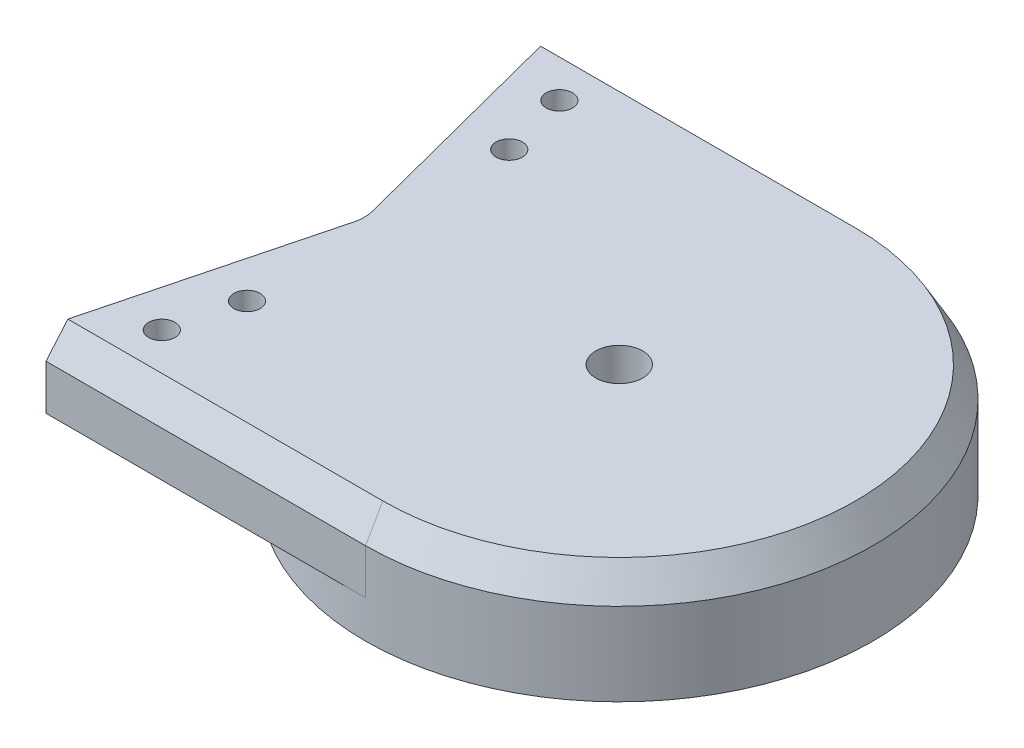
ISO-10303-21;
HEADER;
FILE_DESCRIPTION(('STEP AP214'),'2;1');
FILE_NAME('part.step','',(''),(''),'','','');
FILE_SCHEMA(('AUTOMOTIVE_DESIGN { 1 0 10303 214 1 1 1 1 }'));
ENDSEC;
DATA;
#1=APPLICATION_CONTEXT('core data for automotive mechanical design processes');
#2=APPLICATION_PROTOCOL_DEFINITION('international standard','automotive_design',2000,#1);
#3=PRODUCT_CONTEXT('',#1,'mechanical');
#4=PRODUCT('Part','Part','',(#3));
#5=PRODUCT_RELATED_PRODUCT_CATEGORY('part','',(#4));
#6=PRODUCT_DEFINITION_FORMATION('','',#4);
#7=PRODUCT_DEFINITION_CONTEXT('part definition',#1,'design');
#8=PRODUCT_DEFINITION('design','',#6,#7);
#9=PRODUCT_DEFINITION_SHAPE('','',#8);
#10=(LENGTH_UNIT() NAMED_UNIT(*) SI_UNIT(.MILLI.,.METRE.));
#11=(NAMED_UNIT(*) PLANE_ANGLE_UNIT() SI_UNIT($,.RADIAN.));
#12=(NAMED_UNIT(*) SI_UNIT($,.STERADIAN.) SOLID_ANGLE_UNIT());
#13=UNCERTAINTY_MEASURE_WITH_UNIT(LENGTH_MEASURE(1.E-05),#10,'distance_accuracy_value','');
#14=(GEOMETRIC_REPRESENTATION_CONTEXT(3) GLOBAL_UNCERTAINTY_ASSIGNED_CONTEXT((#13)) GLOBAL_UNIT_ASSIGNED_CONTEXT((#10,
#11,#12)) REPRESENTATION_CONTEXT('',''));
#15=CARTESIAN_POINT('',(0.,0.,0.));
#16=DIRECTION('',(0.,0.,1.));
#17=DIRECTION('',(1.,0.,0.));
#18=AXIS2_PLACEMENT_3D('',#15,#16,#17);
#19=CARTESIAN_POINT('',(123.,64.,32.4999999999989));
#20=DIRECTION('',(0.,-1.,0.));
#21=DIRECTION('',(0.,0.,-1.));
#22=AXIS2_PLACEMENT_3D('',#19,#20,#21);
#23=PLANE('',#22);
#24=CARTESIAN_POINT('',(123.,64.,32.4999999999989));
#25=DIRECTION('',(0.,-1.,0.));
#26=DIRECTION('',(0.,0.,-1.));
#27=AXIS2_PLACEMENT_3D('',#24,#25,#26);
#28=CIRCLE('',#27,16.85);
#29=CARTESIAN_POINT('',(123.,64.,15.6499999999989));
#30=VERTEX_POINT('',#29);
#31=EDGE_CURVE('E177',#30,#30,#28,.T.);
#32=ORIENTED_EDGE('',*,*,#31,.F.);
#33=EDGE_LOOP('',(#32));
#34=FACE_BOUND('',#33,.T.);
#35=CARTESIAN_POINT('',(123.,64.,32.4999999999989));
#36=DIRECTION('',(0.,-1.,0.));
#37=DIRECTION('',(0.,0.,-1.));
#38=AXIS2_PLACEMENT_3D('',#35,#36,#37);
#39=CIRCLE('',#38,25.);
#40=CARTESIAN_POINT('',(123.,64.,7.49999999999892));
#41=VERTEX_POINT('',#40);
#42=EDGE_CURVE('E691',#41,#41,#39,.T.);
#43=ORIENTED_EDGE('',*,*,#42,.T.);
#44=EDGE_LOOP('',(#43));
#45=FACE_BOUND('',#44,.T.);
#46=ADVANCED_FACE('F43',(#34,#45),#23,.T.);
#47=CARTESIAN_POINT('',(123.,60.65,32.4999999999989));
#48=DIRECTION('',(0.,-1.,0.));
#49=DIRECTION('',(0.,0.,-1.));
#50=AXIS2_PLACEMENT_3D('',#47,#48,#49);
#51=PLANE('',#50);
#52=CARTESIAN_POINT('',(123.,60.65,32.4999999999989));
#53=DIRECTION('',(0.,-1.,0.));
#54=DIRECTION('',(0.,0.,-1.));
#55=AXIS2_PLACEMENT_3D('',#52,#53,#54);
#56=CIRCLE('',#55,16.85);
#57=CARTESIAN_POINT('',(123.,60.65,15.6499999999989));
#58=VERTEX_POINT('',#57);
#59=EDGE_CURVE('E181',#58,#58,#56,.T.);
#60=ORIENTED_EDGE('',*,*,#59,.T.);
#61=EDGE_LOOP('',(#60));
#62=FACE_BOUND('',#61,.T.);
#63=CARTESIAN_POINT('',(123.,60.65,32.4999999999989));
#64=DIRECTION('',(0.,-1.,0.));
#65=DIRECTION('',(0.,0.,-1.));
#66=AXIS2_PLACEMENT_3D('',#63,#64,#65);
#67=CIRCLE('',#66,10.);
#68=CARTESIAN_POINT('',(123.,60.65,42.4999999999989));
#69=VERTEX_POINT('',#68);
#70=EDGE_CURVE('E172',#69,#69,#67,.T.);
#71=ORIENTED_EDGE('',*,*,#70,.F.);
#72=EDGE_LOOP('',(#71));
#73=FACE_BOUND('',#72,.T.);
#74=ADVANCED_FACE('F343',(#62,#73),#51,.T.);
#75=CARTESIAN_POINT('',(123.,64.,32.4999999999989));
#76=DIRECTION('',(0.,-1.,0.));
#77=DIRECTION('',(0.,0.,-1.));
#78=AXIS2_PLACEMENT_3D('',#75,#76,#77);
#79=CIRCLE('',#78,42.5);
#80=CARTESIAN_POINT('',(123.,64.,-10.0000000000011));
#81=VERTEX_POINT('',#80);
#82=EDGE_CURVE('E144',#81,#81,#79,.T.);
#83=ORIENTED_EDGE('',*,*,#82,.F.);
#84=EDGE_LOOP('',(#83));
#85=FACE_BOUND('',#84,.T.);
#86=CARTESIAN_POINT('',(123.,64.,32.4999999999989));
#87=DIRECTION('',(0.,-1.,0.));
#88=DIRECTION('',(0.,0.,-1.));
#89=AXIS2_PLACEMENT_3D('',#86,#87,#88);
#90=CIRCLE('',#89,55.);
#91=CARTESIAN_POINT('',(123.,64.,-22.5000000000011));
#92=VERTEX_POINT('',#91);
#93=EDGE_CURVE('E185',#92,#92,#90,.T.);
#94=ORIENTED_EDGE('',*,*,#93,.T.);
#95=EDGE_LOOP('',(#94));
#96=FACE_BOUND('',#95,.T.);
#97=ADVANCED_FACE('F320',(#85,#96),#23,.T.);
#98=CARTESIAN_POINT('',(54.1867937562286,85.,-20.381197846483));
#99=DIRECTION('',(0.,-1.,0.));
#100=DIRECTION('',(0.,0.,-1.));
#101=AXIS2_PLACEMENT_3D('',#98,#99,#100);
#102=CYLINDRICAL_SURFACE('',#101,2.);
#103=CARTESIAN_POINT('',(54.1867937562286,80.,-20.381197846483));
#104=DIRECTION('',(0.,1.,0.));
#105=DIRECTION('',(0.,0.,1.));
#106=AXIS2_PLACEMENT_3D('',#103,#104,#105);
#107=CIRCLE('',#106,2.);
#108=CARTESIAN_POINT('',(54.1867937562286,80.,-18.381197846483));
#109=VERTEX_POINT('',#108);
#110=EDGE_CURVE('E48',#109,#109,#107,.F.);
#111=ORIENTED_EDGE('',*,*,#110,.F.);
#112=EDGE_LOOP('',(#111));
#113=FACE_BOUND('',#112,.T.);
#114=CARTESIAN_POINT('',(54.1867937562286,65.,-20.381197846483));
#115=DIRECTION('',(0.,-1.,0.));
#116=DIRECTION('',(0.,0.,-1.));
#117=AXIS2_PLACEMENT_3D('',#114,#115,#116);
#118=CIRCLE('',#117,2.);
#119=CARTESIAN_POINT('',(54.1867937562286,65.,-22.381197846483));
#120=VERTEX_POINT('',#119);
#121=EDGE_CURVE('E213',#120,#120,#118,.F.);
#122=ORIENTED_EDGE('',*,*,#121,.F.);
#123=EDGE_LOOP('',(#122));
#124=FACE_BOUND('',#123,.T.);
#125=ADVANCED_FACE('F316',(#113,#124),#102,.F.);
#126=CARTESIAN_POINT('',(58.8534604228953,85.,-2.38119784648301));
#127=DIRECTION('',(0.,-1.,0.));
#128=DIRECTION('',(0.,0.,-1.));
#129=AXIS2_PLACEMENT_3D('',#126,#127,#128);
#130=CYLINDRICAL_SURFACE('',#129,2.);
#131=CARTESIAN_POINT('',(58.8534604228953,80.,-2.38119784648301));
#132=DIRECTION('',(0.,1.,0.));
#133=DIRECTION('',(0.,0.,1.));
#134=AXIS2_PLACEMENT_3D('',#131,#132,#133);
#135=CIRCLE('',#134,2.);
#136=CARTESIAN_POINT('',(58.8534604228953,80.,-0.381197846483007));
#137=VERTEX_POINT('',#136);
#138=EDGE_CURVE('E305',#137,#137,#135,.F.);
#139=ORIENTED_EDGE('',*,*,#138,.F.);
#140=EDGE_LOOP('',(#139));
#141=FACE_BOUND('',#140,.T.);
#142=CARTESIAN_POINT('',(58.8534604228953,65.,-2.38119784648301));
#143=DIRECTION('',(0.,-1.,0.));
#144=DIRECTION('',(0.,0.,-1.));
#145=AXIS2_PLACEMENT_3D('',#142,#143,#144);
#146=CIRCLE('',#145,2.);
#147=CARTESIAN_POINT('',(58.8534604228953,65.,-4.38119784648301));
#148=VERTEX_POINT('',#147);
#149=EDGE_CURVE('E209',#148,#148,#146,.F.);
#150=ORIENTED_EDGE('',*,*,#149,.F.);
#151=EDGE_LOOP('',(#150));
#152=FACE_BOUND('',#151,.T.);
#153=ADVANCED_FACE('F319',(#141,#152),#130,.F.);
#154=CARTESIAN_POINT('',(58.8534604228953,85.,67.3811978464809));
#155=DIRECTION('',(0.,-1.,0.));
#156=DIRECTION('',(0.,0.,-1.));
#157=AXIS2_PLACEMENT_3D('',#154,#155,#156);
#158=CYLINDRICAL_SURFACE('',#157,2.);
#159=CARTESIAN_POINT('',(58.8534604228953,80.,67.3811978464809));
#160=DIRECTION('',(0.,1.,0.));
#161=DIRECTION('',(0.,0.,1.));
#162=AXIS2_PLACEMENT_3D('',#159,#160,#161);
#163=CIRCLE('',#162,2.);
#164=CARTESIAN_POINT('',(58.8534604228953,80.,69.3811978464809));
#165=VERTEX_POINT('',#164);
#166=EDGE_CURVE('E302',#165,#165,#163,.F.);
#167=ORIENTED_EDGE('',*,*,#166,.F.);
#168=EDGE_LOOP('',(#167));
#169=FACE_BOUND('',#168,.T.);
#170=CARTESIAN_POINT('',(58.8534604228953,65.,67.3811978464809));
#171=DIRECTION('',(0.,-1.,0.));
#172=DIRECTION('',(0.,0.,-1.));
#173=AXIS2_PLACEMENT_3D('',#170,#171,#172);
#174=CIRCLE('',#173,2.);
#175=CARTESIAN_POINT('',(58.8534604228953,65.,65.3811978464809));
#176=VERTEX_POINT('',#175);
#177=EDGE_CURVE('E205',#176,#176,#174,.F.);
#178=ORIENTED_EDGE('',*,*,#177,.F.);
#179=EDGE_LOOP('',(#178));
#180=FACE_BOUND('',#179,.T.);
#181=ADVANCED_FACE('F412',(#169,#180),#158,.F.);
#182=CARTESIAN_POINT('',(54.1867937562286,85.,85.3811978464809));
#183=DIRECTION('',(0.,-1.,0.));
#184=DIRECTION('',(0.,0.,-1.));
#185=AXIS2_PLACEMENT_3D('',#182,#183,#184);
#186=CYLINDRICAL_SURFACE('',#185,2.);
#187=CARTESIAN_POINT('',(54.1867937562286,80.,85.3811978464809));
#188=DIRECTION('',(0.,1.,0.));
#189=DIRECTION('',(0.,0.,1.));
#190=AXIS2_PLACEMENT_3D('',#187,#188,#189);
#191=CIRCLE('',#190,2.);
#192=CARTESIAN_POINT('',(54.1867937562286,80.,87.3811978464809));
#193=VERTEX_POINT('',#192);
#194=EDGE_CURVE('E222',#193,#193,#191,.F.);
#195=ORIENTED_EDGE('',*,*,#194,.F.);
#196=EDGE_LOOP('',(#195));
#197=FACE_BOUND('',#196,.T.);
#198=CARTESIAN_POINT('',(54.1867937562286,65.,85.3811978464809));
#199=DIRECTION('',(0.,-1.,0.));
#200=DIRECTION('',(0.,0.,-1.));
#201=AXIS2_PLACEMENT_3D('',#198,#199,#200);
#202=CIRCLE('',#201,2.);
#203=CARTESIAN_POINT('',(54.1867937562286,65.,83.3811978464809));
#204=VERTEX_POINT('',#203);
#205=EDGE_CURVE('E201',#204,#204,#202,.F.);
#206=ORIENTED_EDGE('',*,*,#205,.F.);
#207=EDGE_LOOP('',(#206));
#208=FACE_BOUND('',#207,.T.);
#209=ADVANCED_FACE('F404',(#197,#208),#186,.F.);
#210=CARTESIAN_POINT('',(-35.,23.,-35.));
#211=DIRECTION('',(0.,0.,1.));
#212=DIRECTION('',(1.,0.,0.));
#213=AXIS2_PLACEMENT_3D('',#210,#211,#212);
#214=PLANE('',#213);
#215=DIRECTION('',(1.,0.,0.));
#216=VECTOR('',#215,1.);
#217=CARTESIAN_POINT('',(-35.,65.,-35.));
#218=LINE('',#217,#216);
#219=CARTESIAN_POINT('',(38.,65.,-35.));
#220=VERTEX_POINT('',#219);
#221=CARTESIAN_POINT('',(123.,65.,-35.));
#222=VERTEX_POINT('',#221);
#223=EDGE_CURVE('E69',#220,#222,#218,.T.);
#224=ORIENTED_EDGE('',*,*,#223,.F.);
#225=DIRECTION('',(0.,-1.,0.));
#226=VECTOR('',#225,1.);
#227=CARTESIAN_POINT('',(38.0000000000001,85.,-35.));
#228=LINE('',#227,#226);
#229=CARTESIAN_POINT('',(38.0000000000001,76.9999999999999,-35.));
#230=VERTEX_POINT('',#229);
#231=EDGE_CURVE('E62',#230,#220,#228,.T.);
#232=ORIENTED_EDGE('',*,*,#231,.F.);
#233=DIRECTION('',(1.,0.,0.));
#234=VECTOR('',#233,1.);
#235=CARTESIAN_POINT('',(123.,77.,-34.9999999999999));
#236=LINE('',#235,#234);
#237=CARTESIAN_POINT('',(123.,77.,-35.));
#238=VERTEX_POINT('',#237);
#239=EDGE_CURVE('E288',#230,#238,#236,.T.);
#240=ORIENTED_EDGE('',*,*,#239,.T.);
#241=DIRECTION('',(0.,-1.,0.));
#242=VECTOR('',#241,1.);
#243=CARTESIAN_POINT('',(123.,75.,-35.));
#244=LINE('',#243,#242);
#245=EDGE_CURVE('E276',#238,#222,#244,.T.);
#246=ORIENTED_EDGE('',*,*,#245,.T.);
#247=EDGE_LOOP('',(#224,#232,#240,#246));
#248=FACE_BOUND('',#247,.T.);
#249=ADVANCED_FACE('F402',(#248),#214,.F.);
#250=CARTESIAN_POINT('',(38.,55.,99.9999999999978));
#251=DIRECTION('',(0.,0.,-1.));
#252=DIRECTION('',(-1.,0.,0.));
#253=AXIS2_PLACEMENT_3D('',#250,#251,#252);
#254=PLANE('',#253);
#255=DIRECTION('',(-1.,0.,0.));
#256=VECTOR('',#255,1.);
#257=CARTESIAN_POINT('',(-35.,77.,99.9999999999978));
#258=LINE('',#257,#256);
#259=CARTESIAN_POINT('',(123.,77.,99.9999999999978));
#260=VERTEX_POINT('',#259);
#261=CARTESIAN_POINT('',(38.0000000000001,76.9999999999999,99.9999999999978));
#262=VERTEX_POINT('',#261);
#263=EDGE_CURVE('E11',#260,#262,#258,.T.);
#264=ORIENTED_EDGE('',*,*,#263,.T.);
#265=DIRECTION('',(0.,-1.,0.));
#266=VECTOR('',#265,1.);
#267=CARTESIAN_POINT('',(38.0000000000001,85.,99.9999999999978));
#268=LINE('',#267,#266);
#269=CARTESIAN_POINT('',(38.0000000000001,65.,99.9999999999978));
#270=VERTEX_POINT('',#269);
#271=EDGE_CURVE('E154',#262,#270,#268,.T.);
#272=ORIENTED_EDGE('',*,*,#271,.T.);
#273=DIRECTION('',(-1.,0.,0.));
#274=VECTOR('',#273,1.);
#275=CARTESIAN_POINT('',(123.,65.,99.9999999999978));
#276=LINE('',#275,#274);
#277=CARTESIAN_POINT('',(123.,65.,99.9999999999978));
#278=VERTEX_POINT('',#277);
#279=EDGE_CURVE('E195',#278,#270,#276,.T.);
#280=ORIENTED_EDGE('',*,*,#279,.F.);
#281=DIRECTION('',(0.,-1.,0.));
#282=VECTOR('',#281,1.);
#283=CARTESIAN_POINT('',(123.,75.,99.9999999999978));
#284=LINE('',#283,#282);
#285=EDGE_CURVE('E272',#260,#278,#284,.T.);
#286=ORIENTED_EDGE('',*,*,#285,.F.);
#287=EDGE_LOOP('',(#264,#272,#280,#286));
#288=FACE_BOUND('',#287,.T.);
#289=ADVANCED_FACE('F383',(#288),#254,.F.);
#290=CARTESIAN_POINT('',(123.,55.,32.4999999999989));
#291=DIRECTION('',(0.,1.,0.));
#292=DIRECTION('',(0.,0.,1.));
#293=AXIS2_PLACEMENT_3D('',#290,#291,#292);
#294=PLANE('',#293);
#295=CARTESIAN_POINT('',(123.,55.,32.4999999999989));
#296=DIRECTION('',(0.,-1.,0.));
#297=DIRECTION('',(0.,0.,-1.));
#298=AXIS2_PLACEMENT_3D('',#295,#296,#297);
#299=CIRCLE('',#298,63.);
#300=CARTESIAN_POINT('',(123.,55.,-30.5000000000011));
#301=VERTEX_POINT('',#300);
#302=EDGE_CURVE('E259',#301,#301,#299,.T.);
#303=ORIENTED_EDGE('',*,*,#302,.F.);
#304=EDGE_LOOP('',(#303));
#305=FACE_BOUND('',#304,.T.);
#306=CARTESIAN_POINT('',(123.,55.,32.4999999999989));
#307=DIRECTION('',(0.,1.,0.));
#308=DIRECTION('',(0.,0.,1.));
#309=AXIS2_PLACEMENT_3D('',#306,#307,#308);
#310=CIRCLE('',#309,67.4999999999989);
#311=CARTESIAN_POINT('',(123.,55.,99.9999999999978));
#312=VERTEX_POINT('',#311);
#313=EDGE_CURVE('E265',#312,#312,#310,.T.);
#314=ORIENTED_EDGE('',*,*,#313,.F.);
#315=EDGE_LOOP('',(#314));
#316=FACE_BOUND('',#315,.T.);
#317=ADVANCED_FACE('F380',(#305,#316),#294,.F.);
#318=CARTESIAN_POINT('',(123.,75.,32.4999999999989));
#319=DIRECTION('',(0.,-1.,0.));
#320=DIRECTION('',(0.,0.,-1.));
#321=AXIS2_PLACEMENT_3D('',#318,#319,#320);
#322=CYLINDRICAL_SURFACE('',#321,67.4999999999989);
#323=ORIENTED_EDGE('',*,*,#313,.T.);
#324=EDGE_LOOP('',(#323));
#325=FACE_BOUND('',#324,.T.);
#326=ORIENTED_EDGE('',*,*,#245,.F.);
#327=CARTESIAN_POINT('',(123.,77.,32.4999999999989));
#328=DIRECTION('',(0.,1.,0.));
#329=DIRECTION('',(0.,0.,1.));
#330=AXIS2_PLACEMENT_3D('',#327,#328,#329);
#331=CIRCLE('',#330,67.4999999999989);
#332=EDGE_CURVE('E54',#238,#260,#331,.F.);
#333=ORIENTED_EDGE('',*,*,#332,.T.);
#334=ORIENTED_EDGE('',*,*,#285,.T.);
#335=CARTESIAN_POINT('',(123.,65.,32.4999999999989));
#336=DIRECTION('',(0.,1.,0.));
#337=DIRECTION('',(0.,0.,-1.));
#338=AXIS2_PLACEMENT_3D('',#335,#336,#337);
#339=CIRCLE('',#338,67.4999999999989);
#340=EDGE_CURVE('E192',#222,#278,#339,.T.);
#341=ORIENTED_EDGE('',*,*,#340,.F.);
#342=EDGE_LOOP('',(#326,#333,#334,#341));
#343=FACE_BOUND('',#342,.T.);
#344=ADVANCED_FACE('F376',(#325,#343),#322,.T.);
#345=CARTESIAN_POINT('',(123.,58.,32.4999999999989));
#346=DIRECTION('',(0.,-1.,0.));
#347=DIRECTION('',(0.,0.,-1.));
#348=AXIS2_PLACEMENT_3D('',#345,#346,#347);
#349=CYLINDRICAL_SURFACE('',#348,63.);
#350=CARTESIAN_POINT('',(123.,58.,32.4999999999989));
#351=DIRECTION('',(0.,-1.,0.));
#352=DIRECTION('',(0.,0.,-1.));
#353=AXIS2_PLACEMENT_3D('',#350,#351,#352);
#354=CIRCLE('',#353,63.);
#355=CARTESIAN_POINT('',(123.,58.,-30.5000000000011));
#356=VERTEX_POINT('',#355);
#357=EDGE_CURVE('E261',#356,#356,#354,.T.);
#358=ORIENTED_EDGE('',*,*,#357,.F.);
#359=EDGE_LOOP('',(#358));
#360=FACE_BOUND('',#359,.T.);
#361=ORIENTED_EDGE('',*,*,#302,.T.);
#362=EDGE_LOOP('',(#361));
#363=FACE_BOUND('',#362,.T.);
#364=ADVANCED_FACE('F370',(#360,#363),#349,.F.);
#365=CARTESIAN_POINT('',(123.,58.,32.4999999999989));
#366=DIRECTION('',(0.,-1.,0.));
#367=DIRECTION('',(0.,0.,-1.));
#368=AXIS2_PLACEMENT_3D('',#365,#366,#367);
#369=PLANE('',#368);
#370=CARTESIAN_POINT('',(123.,58.,32.4999999999989));
#371=DIRECTION('',(0.,-1.,0.));
#372=DIRECTION('',(0.,0.,-1.));
#373=AXIS2_PLACEMENT_3D('',#370,#371,#372);
#374=CIRCLE('',#373,55.);
#375=CARTESIAN_POINT('',(123.,58.,-22.5000000000011));
#376=VERTEX_POINT('',#375);
#377=EDGE_CURVE('E255',#376,#376,#374,.T.);
#378=ORIENTED_EDGE('',*,*,#377,.F.);
#379=EDGE_LOOP('',(#378));
#380=FACE_BOUND('',#379,.T.);
#381=ORIENTED_EDGE('',*,*,#357,.T.);
#382=EDGE_LOOP('',(#381));
#383=FACE_BOUND('',#382,.T.);
#384=ADVANCED_FACE('F364',(#380,#383),#369,.T.);
#385=CARTESIAN_POINT('',(123.,68.,32.4999999999989));
#386=DIRECTION('',(0.,-1.,0.));
#387=DIRECTION('',(0.,0.,-1.));
#388=AXIS2_PLACEMENT_3D('',#385,#386,#387);
#389=CYLINDRICAL_SURFACE('',#388,55.);
#390=ORIENTED_EDGE('',*,*,#93,.F.);
#391=EDGE_LOOP('',(#390));
#392=FACE_BOUND('',#391,.T.);
#393=ORIENTED_EDGE('',*,*,#377,.T.);
#394=EDGE_LOOP('',(#393));
#395=FACE_BOUND('',#394,.T.);
#396=ADVANCED_FACE('F361',(#392,#395),#389,.F.);
#397=CARTESIAN_POINT('',(123.,85.,32.4999999999989));
#398=DIRECTION('',(0.,1.,0.));
#399=DIRECTION('',(0.,0.,1.));
#400=AXIS2_PLACEMENT_3D('',#397,#398,#399);
#401=PLANE('',#400);
#402=DIRECTION('',(-0.250962158783726,0.,0.967996898165801));
#403=VECTOR('',#402,1.);
#404=CARTESIAN_POINT('',(54.849357366116,85.,35.0096215878362));
#405=LINE('',#404,#403);
#406=CARTESIAN_POINT('',(54.849357366116,85.,35.0096215878362));
#407=VERTEX_POINT('',#406);
#408=CARTESIAN_POINT('',(39.1974672249859,85.,95.3811978464808));
#409=VERTEX_POINT('',#408);
#410=EDGE_CURVE('E130',#407,#409,#405,.T.);
#411=ORIENTED_EDGE('',*,*,#410,.T.);
#412=DIRECTION('',(1.,0.,0.));
#413=VECTOR('',#412,1.);
#414=CARTESIAN_POINT('',(123.,85.,95.3811978464808));
#415=LINE('',#414,#413);
#416=CARTESIAN_POINT('',(123.,85.,95.3811978464808));
#417=VERTEX_POINT('',#416);
#418=EDGE_CURVE('E280',#409,#417,#415,.T.);
#419=ORIENTED_EDGE('',*,*,#418,.T.);
#420=CARTESIAN_POINT('',(123.,85.,32.4999999999989));
#421=DIRECTION('',(0.,1.,0.));
#422=DIRECTION('',(0.,0.,1.));
#423=AXIS2_PLACEMENT_3D('',#420,#421,#422);
#424=CIRCLE('',#423,62.8811978464819);
#425=CARTESIAN_POINT('',(123.,85.,-30.381197846483));
#426=VERTEX_POINT('',#425);
#427=EDGE_CURVE('E283',#417,#426,#424,.T.);
#428=ORIENTED_EDGE('',*,*,#427,.T.);
#429=DIRECTION('',(-1.,0.,0.));
#430=VECTOR('',#429,1.);
#431=CARTESIAN_POINT('',(-35.,85.,-30.381197846483));
#432=LINE('',#431,#430);
#433=CARTESIAN_POINT('',(39.1974672249859,85.,-30.381197846483));
#434=VERTEX_POINT('',#433);
#435=EDGE_CURVE('E136',#426,#434,#432,.T.);
#436=ORIENTED_EDGE('',*,*,#435,.T.);
#437=DIRECTION('',(0.250962158783726,0.,0.967996898165801));
#438=VECTOR('',#437,1.);
#439=CARTESIAN_POINT('',(38.0000000000001,85.,-35.));
#440=LINE('',#439,#438);
#441=CARTESIAN_POINT('',(54.849357366116,85.,29.9903784121616));
#442=VERTEX_POINT('',#441);
#443=EDGE_CURVE('E114',#434,#442,#440,.T.);
#444=ORIENTED_EDGE('',*,*,#443,.T.);
#445=CARTESIAN_POINT('',(45.169388384458,85.,32.4999999999989));
#446=DIRECTION('',(0.,-1.,0.));
#447=DIRECTION('',(0.,0.,1.));
#448=AXIS2_PLACEMENT_3D('',#445,#446,#447);
#449=CIRCLE('',#448,9.99999999999999);
#450=EDGE_CURVE('E124',#442,#407,#449,.T.);
#451=ORIENTED_EDGE('',*,*,#450,.T.);
#452=EDGE_LOOP('',(#411,#419,#428,#436,#444,#451));
#453=FACE_BOUND('',#452,.T.);
#454=CARTESIAN_POINT('',(54.1867937562286,85.,-20.381197846483));
#455=DIRECTION('',(0.,1.,0.));
#456=DIRECTION('',(0.,0.,1.));
#457=AXIS2_PLACEMENT_3D('',#454,#455,#456);
#458=CIRCLE('',#457,3.5);
#459=CARTESIAN_POINT('',(54.1867937562286,85.,-16.881197846483));
#460=VERTEX_POINT('',#459);
#461=EDGE_CURVE('E223',#460,#460,#458,.T.);
#462=ORIENTED_EDGE('',*,*,#461,.F.);
#463=EDGE_LOOP('',(#462));
#464=FACE_BOUND('',#463,.T.);
#465=CARTESIAN_POINT('',(58.8534604228953,85.,-2.38119784648301));
#466=DIRECTION('',(0.,1.,0.));
#467=DIRECTION('',(0.,0.,1.));
#468=AXIS2_PLACEMENT_3D('',#465,#466,#467);
#469=CIRCLE('',#468,3.5);
#470=CARTESIAN_POINT('',(58.8534604228953,85.,1.11880215351699));
#471=VERTEX_POINT('',#470);
#472=EDGE_CURVE('E231',#471,#471,#469,.T.);
#473=ORIENTED_EDGE('',*,*,#472,.F.);
#474=EDGE_LOOP('',(#473));
#475=FACE_BOUND('',#474,.T.);
#476=CARTESIAN_POINT('',(58.8534604228953,85.,67.3811978464809));
#477=DIRECTION('',(0.,1.,0.));
#478=DIRECTION('',(0.,0.,1.));
#479=AXIS2_PLACEMENT_3D('',#476,#477,#478);
#480=CIRCLE('',#479,3.5);
#481=CARTESIAN_POINT('',(58.8534604228953,85.,70.8811978464809));
#482=VERTEX_POINT('',#481);
#483=EDGE_CURVE('E239',#482,#482,#480,.T.);
#484=ORIENTED_EDGE('',*,*,#483,.F.);
#485=EDGE_LOOP('',(#484));
#486=FACE_BOUND('',#485,.T.);
#487=CARTESIAN_POINT('',(54.1867937562286,85.,85.3811978464809));
#488=DIRECTION('',(0.,1.,0.));
#489=DIRECTION('',(0.,0.,1.));
#490=AXIS2_PLACEMENT_3D('',#487,#488,#489);
#491=CIRCLE('',#490,3.5);
#492=CARTESIAN_POINT('',(54.1867937562286,85.,88.8811978464809));
#493=VERTEX_POINT('',#492);
#494=EDGE_CURVE('E217',#493,#493,#491,.T.);
#495=ORIENTED_EDGE('',*,*,#494,.F.);
#496=EDGE_LOOP('',(#495));
#497=FACE_BOUND('',#496,.T.);
#498=CARTESIAN_POINT('',(123.,85.,32.4999999999989));
#499=DIRECTION('',(0.,-1.,0.));
#500=DIRECTION('',(0.,0.,-1.));
#501=AXIS2_PLACEMENT_3D('',#498,#499,#500);
#502=CIRCLE('',#501,6.25);
#503=CARTESIAN_POINT('',(123.,85.,26.2499999999989));
#504=VERTEX_POINT('',#503);
#505=EDGE_CURVE('E250',#504,#504,#502,.T.);
#506=ORIENTED_EDGE('',*,*,#505,.T.);
#507=EDGE_LOOP('',(#506));
#508=FACE_BOUND('',#507,.T.);
#509=ADVANCED_FACE('F133',(#453,#464,#475,#486,#497,#508),#401,.T.);
#510=CARTESIAN_POINT('',(123.,85.,95.3811978464808));
#511=DIRECTION('',(0.,0.499999999999996,0.866025403784441));
#512=DIRECTION('',(-1.,0.,0.));
#513=AXIS2_PLACEMENT_3D('',#510,#511,#512);
#514=PLANE('',#513);
#515=DIRECTION('',(0.128554028641394,0.858839563766164,-0.49585125333109));
#516=VECTOR('',#515,1.);
#517=CARTESIAN_POINT('',(40.5823994698344,94.2524101934549,90.0393163306369));
#518=LINE('',#517,#516);
#519=EDGE_CURVE('E165',#262,#409,#518,.T.);
#520=ORIENTED_EDGE('',*,*,#519,.F.);
#521=ORIENTED_EDGE('',*,*,#263,.F.);
#522=DIRECTION('',(0.,-0.866025403784441,0.499999999999996));
#523=VECTOR('',#522,1.);
#524=CARTESIAN_POINT('',(123.,85.,95.3811978464808));
#525=LINE('',#524,#523);
#526=EDGE_CURVE('E260',#417,#260,#525,.T.);
#527=ORIENTED_EDGE('',*,*,#526,.F.);
#528=ORIENTED_EDGE('',*,*,#418,.F.);
#529=EDGE_LOOP('',(#520,#521,#527,#528));
#530=FACE_BOUND('',#529,.T.);
#531=ADVANCED_FACE('F46',(#530),#514,.T.);
#532=CARTESIAN_POINT('',(123.,85.,32.4999999999989));
#533=DIRECTION('',(0.,-1.,0.));
#534=DIRECTION('',(0.,0.,-1.));
#535=AXIS2_PLACEMENT_3D('',#532,#533,#534);
#536=CONICAL_SURFACE('',#535,62.8811978464819,0.523598775598295);
#537=ORIENTED_EDGE('',*,*,#526,.T.);
#538=ORIENTED_EDGE('',*,*,#332,.F.);
#539=DIRECTION('',(0.,-0.866025403784441,-0.499999999999996));
#540=VECTOR('',#539,1.);
#541=CARTESIAN_POINT('',(123.,85.,-30.381197846483));
#542=LINE('',#541,#540);
#543=EDGE_CURVE('E254',#426,#238,#542,.T.);
#544=ORIENTED_EDGE('',*,*,#543,.F.);
#545=ORIENTED_EDGE('',*,*,#427,.F.);
#546=EDGE_LOOP('',(#537,#538,#544,#545));
#547=FACE_BOUND('',#546,.T.);
#548=ADVANCED_FACE('F396',(#547),#536,.T.);
#549=CARTESIAN_POINT('',(123.,85.,-30.381197846483));
#550=DIRECTION('',(0.,0.499999999999997,-0.866025403784441));
#551=DIRECTION('',(1.,0.,0.));
#552=AXIS2_PLACEMENT_3D('',#549,#550,#551);
#553=PLANE('',#552);
#554=DIRECTION('',(-0.128554028641394,-0.858839563766164,-0.495851253331091));
#555=VECTOR('',#554,1.);
#556=CARTESIAN_POINT('',(40.5823994698344,94.2524101934549,-25.039316330639));
#557=LINE('',#556,#555);
#558=EDGE_CURVE('E158',#434,#230,#557,.T.);
#559=ORIENTED_EDGE('',*,*,#558,.F.);
#560=ORIENTED_EDGE('',*,*,#435,.F.);
#561=ORIENTED_EDGE('',*,*,#543,.T.);
#562=ORIENTED_EDGE('',*,*,#239,.F.);
#563=EDGE_LOOP('',(#559,#560,#561,#562));
#564=FACE_BOUND('',#563,.T.);
#565=ADVANCED_FACE('F401',(#564),#553,.T.);
#566=CARTESIAN_POINT('',(123.,85.,32.4999999999989));
#567=DIRECTION('',(0.,-1.,0.));
#568=DIRECTION('',(0.,0.,-1.));
#569=AXIS2_PLACEMENT_3D('',#566,#567,#568);
#570=CYLINDRICAL_SURFACE('',#569,6.25);
#571=ORIENTED_EDGE('',*,*,#505,.F.);
#572=EDGE_LOOP('',(#571));
#573=FACE_BOUND('',#572,.T.);
#574=CARTESIAN_POINT('',(123.,31.65,32.4999999999989));
#575=DIRECTION('',(0.,-1.,0.));
#576=DIRECTION('',(0.,0.,-1.));
#577=AXIS2_PLACEMENT_3D('',#574,#575,#576);
#578=CIRCLE('',#577,6.25);
#579=CARTESIAN_POINT('',(123.,31.65,26.2499999999989));
#580=VERTEX_POINT('',#579);
#581=EDGE_CURVE('E168',#580,#580,#578,.T.);
#582=ORIENTED_EDGE('',*,*,#581,.T.);
#583=EDGE_LOOP('',(#582));
#584=FACE_BOUND('',#583,.T.);
#585=ADVANCED_FACE('F421',(#573,#584),#570,.F.);
#586=CARTESIAN_POINT('',(54.1867937562286,80.,85.3811978464809));
#587=DIRECTION('',(0.,1.,0.));
#588=DIRECTION('',(0.,0.,1.));
#589=AXIS2_PLACEMENT_3D('',#586,#587,#588);
#590=PLANE('',#589);
#591=CARTESIAN_POINT('',(54.1867937562286,80.,85.3811978464809));
#592=DIRECTION('',(0.,1.,0.));
#593=DIRECTION('',(0.,0.,1.));
#594=AXIS2_PLACEMENT_3D('',#591,#592,#593);
#595=CIRCLE('',#594,3.5);
#596=CARTESIAN_POINT('',(54.1867937562286,80.,88.8811978464809));
#597=VERTEX_POINT('',#596);
#598=EDGE_CURVE('E243',#597,#597,#595,.T.);
#599=ORIENTED_EDGE('',*,*,#598,.T.);
#600=EDGE_LOOP('',(#599));
#601=FACE_BOUND('',#600,.T.);
#602=ORIENTED_EDGE('',*,*,#194,.T.);
#603=EDGE_LOOP('',(#602));
#604=FACE_BOUND('',#603,.T.);
#605=ADVANCED_FACE('F464',(#601,#604),#590,.T.);
#606=CARTESIAN_POINT('',(54.1867937562286,80.,85.3811978464809));
#607=DIRECTION('',(0.,1.,0.));
#608=DIRECTION('',(0.,0.,1.));
#609=AXIS2_PLACEMENT_3D('',#606,#607,#608);
#610=CYLINDRICAL_SURFACE('',#609,3.5);
#611=ORIENTED_EDGE('',*,*,#598,.F.);
#612=EDGE_LOOP('',(#611));
#613=FACE_BOUND('',#612,.T.);
#614=ORIENTED_EDGE('',*,*,#494,.T.);
#615=EDGE_LOOP('',(#614));
#616=FACE_BOUND('',#615,.T.);
#617=ADVANCED_FACE('F470',(#613,#616),#610,.F.);
#618=CARTESIAN_POINT('',(58.8534604228953,80.,67.3811978464809));
#619=DIRECTION('',(0.,1.,0.));
#620=DIRECTION('',(0.,0.,1.));
#621=AXIS2_PLACEMENT_3D('',#618,#619,#620);
#622=PLANE('',#621);
#623=CARTESIAN_POINT('',(58.8534604228953,80.,67.3811978464809));
#624=DIRECTION('',(0.,1.,0.));
#625=DIRECTION('',(0.,0.,1.));
#626=AXIS2_PLACEMENT_3D('',#623,#624,#625);
#627=CIRCLE('',#626,3.5);
#628=CARTESIAN_POINT('',(58.8534604228953,80.,70.8811978464809));
#629=VERTEX_POINT('',#628);
#630=EDGE_CURVE('E235',#629,#629,#627,.T.);
#631=ORIENTED_EDGE('',*,*,#630,.T.);
#632=EDGE_LOOP('',(#631));
#633=FACE_BOUND('',#632,.T.);
#634=ORIENTED_EDGE('',*,*,#166,.T.);
#635=EDGE_LOOP('',(#634));
#636=FACE_BOUND('',#635,.T.);
#637=ADVANCED_FACE('F482',(#633,#636),#622,.T.);
#638=CARTESIAN_POINT('',(58.8534604228953,80.,67.3811978464809));
#639=DIRECTION('',(0.,1.,0.));
#640=DIRECTION('',(0.,0.,1.));
#641=AXIS2_PLACEMENT_3D('',#638,#639,#640);
#642=CYLINDRICAL_SURFACE('',#641,3.5);
#643=ORIENTED_EDGE('',*,*,#630,.F.);
#644=EDGE_LOOP('',(#643));
#645=FACE_BOUND('',#644,.T.);
#646=ORIENTED_EDGE('',*,*,#483,.T.);
#647=EDGE_LOOP('',(#646));
#648=FACE_BOUND('',#647,.T.);
#649=ADVANCED_FACE('F485',(#645,#648),#642,.F.);
#650=CARTESIAN_POINT('',(58.8534604228953,80.,-2.38119784648301));
#651=DIRECTION('',(0.,1.,0.));
#652=DIRECTION('',(0.,0.,1.));
#653=AXIS2_PLACEMENT_3D('',#650,#651,#652);
#654=PLANE('',#653);
#655=CARTESIAN_POINT('',(58.8534604228953,80.,-2.38119784648301));
#656=DIRECTION('',(0.,1.,0.));
#657=DIRECTION('',(0.,0.,1.));
#658=AXIS2_PLACEMENT_3D('',#655,#656,#657);
#659=CIRCLE('',#658,3.5);
#660=CARTESIAN_POINT('',(58.8534604228953,80.,1.11880215351699));
#661=VERTEX_POINT('',#660);
#662=EDGE_CURVE('E227',#661,#661,#659,.T.);
#663=ORIENTED_EDGE('',*,*,#662,.T.);
#664=EDGE_LOOP('',(#663));
#665=FACE_BOUND('',#664,.T.);
#666=ORIENTED_EDGE('',*,*,#138,.T.);
#667=EDGE_LOOP('',(#666));
#668=FACE_BOUND('',#667,.T.);
#669=ADVANCED_FACE('F488',(#665,#668),#654,.T.);
#670=CARTESIAN_POINT('',(58.8534604228953,80.,-2.38119784648301));
#671=DIRECTION('',(0.,1.,0.));
#672=DIRECTION('',(0.,0.,1.));
#673=AXIS2_PLACEMENT_3D('',#670,#671,#672);
#674=CYLINDRICAL_SURFACE('',#673,3.5);
#675=ORIENTED_EDGE('',*,*,#662,.F.);
#676=EDGE_LOOP('',(#675));
#677=FACE_BOUND('',#676,.T.);
#678=ORIENTED_EDGE('',*,*,#472,.T.);
#679=EDGE_LOOP('',(#678));
#680=FACE_BOUND('',#679,.T.);
#681=ADVANCED_FACE('F493',(#677,#680),#674,.F.);
#682=CARTESIAN_POINT('',(54.1867937562286,80.,-20.381197846483));
#683=DIRECTION('',(0.,1.,0.));
#684=DIRECTION('',(0.,0.,1.));
#685=AXIS2_PLACEMENT_3D('',#682,#683,#684);
#686=PLANE('',#685);
#687=CARTESIAN_POINT('',(54.1867937562286,80.,-20.381197846483));
#688=DIRECTION('',(0.,1.,0.));
#689=DIRECTION('',(0.,0.,1.));
#690=AXIS2_PLACEMENT_3D('',#687,#688,#689);
#691=CIRCLE('',#690,3.5);
#692=CARTESIAN_POINT('',(54.1867937562286,80.,-16.881197846483));
#693=VERTEX_POINT('',#692);
#694=EDGE_CURVE('E218',#693,#693,#691,.T.);
#695=ORIENTED_EDGE('',*,*,#694,.T.);
#696=EDGE_LOOP('',(#695));
#697=FACE_BOUND('',#696,.T.);
#698=ORIENTED_EDGE('',*,*,#110,.T.);
#699=EDGE_LOOP('',(#698));
#700=FACE_BOUND('',#699,.T.);
#701=ADVANCED_FACE('F314',(#697,#700),#686,.T.);
#702=CARTESIAN_POINT('',(54.1867937562286,80.,-20.381197846483));
#703=DIRECTION('',(0.,1.,0.));
#704=DIRECTION('',(0.,0.,1.));
#705=AXIS2_PLACEMENT_3D('',#702,#703,#704);
#706=CYLINDRICAL_SURFACE('',#705,3.5);
#707=ORIENTED_EDGE('',*,*,#694,.F.);
#708=EDGE_LOOP('',(#707));
#709=FACE_BOUND('',#708,.T.);
#710=ORIENTED_EDGE('',*,*,#461,.T.);
#711=EDGE_LOOP('',(#710));
#712=FACE_BOUND('',#711,.T.);
#713=ADVANCED_FACE('F327',(#709,#712),#706,.F.);
#714=CARTESIAN_POINT('',(123.,65.,32.4999999999989));
#715=DIRECTION('',(0.,-1.,0.));
#716=DIRECTION('',(0.,0.,-1.));
#717=AXIS2_PLACEMENT_3D('',#714,#715,#716);
#718=PLANE('',#717);
#719=DIRECTION('',(-0.250962158783726,0.,0.967996898165801));
#720=VECTOR('',#719,1.);
#721=CARTESIAN_POINT('',(54.849357366116,65.,35.0096215878362));
#722=LINE('',#721,#720);
#723=CARTESIAN_POINT('',(54.849357366116,65.,35.0096215878362));
#724=VERTEX_POINT('',#723);
#725=EDGE_CURVE('E138',#724,#270,#722,.T.);
#726=ORIENTED_EDGE('',*,*,#725,.F.);
#727=CARTESIAN_POINT('',(45.169388384458,65.,32.4999999999989));
#728=DIRECTION('',(0.,-1.,0.));
#729=DIRECTION('',(0.,0.,1.));
#730=AXIS2_PLACEMENT_3D('',#727,#728,#729);
#731=CIRCLE('',#730,9.99999999999999);
#732=CARTESIAN_POINT('',(54.849357366116,65.,29.9903784121616));
#733=VERTEX_POINT('',#732);
#734=EDGE_CURVE('E141',#733,#724,#731,.T.);
#735=ORIENTED_EDGE('',*,*,#734,.F.);
#736=DIRECTION('',(0.250962158783726,0.,0.967996898165801));
#737=VECTOR('',#736,1.);
#738=CARTESIAN_POINT('',(38.0000000000001,65.,-35.));
#739=LINE('',#738,#737);
#740=EDGE_CURVE('E116',#220,#733,#739,.T.);
#741=ORIENTED_EDGE('',*,*,#740,.F.);
#742=ORIENTED_EDGE('',*,*,#223,.T.);
#743=ORIENTED_EDGE('',*,*,#340,.T.);
#744=ORIENTED_EDGE('',*,*,#279,.T.);
#745=EDGE_LOOP('',(#726,#735,#741,#742,#743,#744));
#746=FACE_BOUND('',#745,.T.);
#747=ORIENTED_EDGE('',*,*,#205,.T.);
#748=EDGE_LOOP('',(#747));
#749=FACE_BOUND('',#748,.T.);
#750=ORIENTED_EDGE('',*,*,#177,.T.);
#751=EDGE_LOOP('',(#750));
#752=FACE_BOUND('',#751,.T.);
#753=ORIENTED_EDGE('',*,*,#149,.T.);
#754=EDGE_LOOP('',(#753));
#755=FACE_BOUND('',#754,.T.);
#756=ORIENTED_EDGE('',*,*,#121,.T.);
#757=EDGE_LOOP('',(#756));
#758=FACE_BOUND('',#757,.T.);
#759=ADVANCED_FACE('F324',(#746,#749,#752,#755,#758),#718,.T.);
#760=CARTESIAN_POINT('',(123.,60.65,32.4999999999989));
#761=DIRECTION('',(0.,1.,0.));
#762=DIRECTION('',(0.,0.,1.));
#763=AXIS2_PLACEMENT_3D('',#760,#761,#762);
#764=CYLINDRICAL_SURFACE('',#763,16.85);
#765=ORIENTED_EDGE('',*,*,#59,.F.);
#766=EDGE_LOOP('',(#765));
#767=FACE_BOUND('',#766,.T.);
#768=ORIENTED_EDGE('',*,*,#31,.T.);
#769=EDGE_LOOP('',(#768));
#770=FACE_BOUND('',#769,.T.);
#771=ADVANCED_FACE('F326',(#767,#770),#764,.T.);
#772=CARTESIAN_POINT('',(123.,31.65,32.4999999999989));
#773=DIRECTION('',(0.,-1.,0.));
#774=DIRECTION('',(0.,0.,-1.));
#775=AXIS2_PLACEMENT_3D('',#772,#773,#774);
#776=PLANE('',#775);
#777=CARTESIAN_POINT('',(123.,31.65,32.4999999999989));
#778=DIRECTION('',(0.,-1.,0.));
#779=DIRECTION('',(0.,0.,-1.));
#780=AXIS2_PLACEMENT_3D('',#777,#778,#779);
#781=CIRCLE('',#780,10.);
#782=CARTESIAN_POINT('',(123.,31.65,42.4999999999989));
#783=VERTEX_POINT('',#782);
#784=EDGE_CURVE('E173',#783,#783,#781,.T.);
#785=ORIENTED_EDGE('',*,*,#784,.T.);
#786=EDGE_LOOP('',(#785));
#787=FACE_BOUND('',#786,.T.);
#788=ORIENTED_EDGE('',*,*,#581,.F.);
#789=EDGE_LOOP('',(#788));
#790=FACE_BOUND('',#789,.T.);
#791=ADVANCED_FACE('F333',(#787,#790),#776,.T.);
#792=CARTESIAN_POINT('',(123.,31.65,32.4999999999989));
#793=DIRECTION('',(0.,1.,0.));
#794=DIRECTION('',(0.,0.,1.));
#795=AXIS2_PLACEMENT_3D('',#792,#793,#794);
#796=CYLINDRICAL_SURFACE('',#795,10.);
#797=CARTESIAN_POINT('',(123.,31.65,42.4999999999989));
#798=CARTESIAN_POINT('',(123.,31.9520833333333,42.4999999999989));
#799=CARTESIAN_POINT('',(123.,32.2541666666667,42.4999999999989));
#800=CARTESIAN_POINT('',(123.,32.8583333333333,42.4999999999989));
#801=CARTESIAN_POINT('',(123.,33.1604166666667,42.4999999999989));
#802=CARTESIAN_POINT('',(123.,33.7645833333333,42.4999999999989));
#803=CARTESIAN_POINT('',(123.,34.0666666666667,42.4999999999989));
#804=CARTESIAN_POINT('',(123.,34.6708333333333,42.4999999999989));
#805=CARTESIAN_POINT('',(123.,34.9729166666667,42.4999999999989));
#806=CARTESIAN_POINT('',(123.,35.5770833333333,42.4999999999989));
#807=CARTESIAN_POINT('',(123.,35.8791666666667,42.4999999999989));
#808=CARTESIAN_POINT('',(123.,36.4833333333333,42.4999999999989));
#809=CARTESIAN_POINT('',(123.,36.7854166666667,42.4999999999989));
#810=CARTESIAN_POINT('',(123.,37.3895833333333,42.4999999999989));
#811=CARTESIAN_POINT('',(123.,37.6916666666667,42.4999999999989));
#812=CARTESIAN_POINT('',(123.,38.2958333333333,42.4999999999989));
#813=CARTESIAN_POINT('',(123.,38.5979166666667,42.4999999999989));
#814=CARTESIAN_POINT('',(123.,39.2020833333333,42.4999999999989));
#815=CARTESIAN_POINT('',(123.,39.5041666666667,42.4999999999989));
#816=CARTESIAN_POINT('',(123.,40.1083333333333,42.4999999999989));
#817=CARTESIAN_POINT('',(123.,40.4104166666667,42.4999999999989));
#818=CARTESIAN_POINT('',(123.,41.0145833333333,42.4999999999989));
#819=CARTESIAN_POINT('',(123.,41.3166666666667,42.4999999999989));
#820=CARTESIAN_POINT('',(123.,41.9208333333333,42.4999999999989));
#821=CARTESIAN_POINT('',(123.,42.2229166666667,42.4999999999989));
#822=CARTESIAN_POINT('',(123.,42.8270833333333,42.4999999999989));
#823=CARTESIAN_POINT('',(123.,43.1291666666667,42.4999999999989));
#824=CARTESIAN_POINT('',(123.,43.7333333333333,42.4999999999989));
#825=CARTESIAN_POINT('',(123.,44.0354166666667,42.4999999999989));
#826=CARTESIAN_POINT('',(123.,44.6395833333333,42.4999999999989));
#827=CARTESIAN_POINT('',(123.,44.9416666666667,42.4999999999989));
#828=CARTESIAN_POINT('',(123.,45.5458333333333,42.4999999999989));
#829=CARTESIAN_POINT('',(123.,45.8479166666667,42.4999999999989));
#830=CARTESIAN_POINT('',(123.,46.4520833333333,42.4999999999989));
#831=CARTESIAN_POINT('',(123.,46.7541666666667,42.4999999999989));
#832=CARTESIAN_POINT('',(123.,47.3583333333333,42.4999999999989));
#833=CARTESIAN_POINT('',(123.,47.6604166666667,42.4999999999989));
#834=CARTESIAN_POINT('',(123.,48.2645833333333,42.4999999999989));
#835=CARTESIAN_POINT('',(123.,48.5666666666667,42.4999999999989));
#836=CARTESIAN_POINT('',(123.,49.1708333333333,42.4999999999989));
#837=CARTESIAN_POINT('',(123.,49.4729166666667,42.4999999999989));
#838=CARTESIAN_POINT('',(123.,50.0770833333333,42.4999999999989));
#839=CARTESIAN_POINT('',(123.,50.3791666666667,42.4999999999989));
#840=CARTESIAN_POINT('',(123.,50.9833333333333,42.4999999999989));
#841=CARTESIAN_POINT('',(123.,51.2854166666667,42.4999999999989));
#842=CARTESIAN_POINT('',(123.,51.8895833333333,42.4999999999989));
#843=CARTESIAN_POINT('',(123.,52.1916666666667,42.4999999999989));
#844=CARTESIAN_POINT('',(123.,52.7958333333333,42.4999999999989));
#845=CARTESIAN_POINT('',(123.,53.0979166666667,42.4999999999989));
#846=CARTESIAN_POINT('',(123.,53.7020833333333,42.4999999999989));
#847=CARTESIAN_POINT('',(123.,54.0041666666667,42.4999999999989));
#848=CARTESIAN_POINT('',(123.,54.6083333333333,42.4999999999989));
#849=CARTESIAN_POINT('',(123.,54.9104166666667,42.4999999999989));
#850=CARTESIAN_POINT('',(123.,55.5145833333333,42.4999999999989));
#851=CARTESIAN_POINT('',(123.,55.8166666666667,42.4999999999989));
#852=CARTESIAN_POINT('',(123.,56.4208333333333,42.4999999999989));
#853=CARTESIAN_POINT('',(123.,56.7229166666667,42.4999999999989));
#854=CARTESIAN_POINT('',(123.,57.3270833333333,42.4999999999989));
#855=CARTESIAN_POINT('',(123.,57.6291666666667,42.4999999999989));
#856=CARTESIAN_POINT('',(123.,58.2333333333333,42.4999999999989));
#857=CARTESIAN_POINT('',(123.,58.5354166666667,42.4999999999989));
#858=CARTESIAN_POINT('',(123.,59.1395833333333,42.4999999999989));
#859=CARTESIAN_POINT('',(123.,59.4416666666667,42.4999999999989));
#860=CARTESIAN_POINT('',(123.,60.0458333333333,42.4999999999989));
#861=CARTESIAN_POINT('',(123.,60.3479166666667,42.4999999999989));
#862=CARTESIAN_POINT('',(123.,60.65,42.4999999999989));
#863=B_SPLINE_CURVE_WITH_KNOTS('',3,(#797,#798,#799,#800,#801,#802,#803,#804,#805,#806,#807,
#808,#809,#810,#811,#812,#813,#814,#815,#816,#817,#818,#819,#820,#821,#822,#823,#824,#825,#826,
#827,#828,#829,#830,#831,#832,#833,#834,#835,#836,#837,#838,#839,#840,#841,#842,#843,#844,#845,
#846,#847,#848,#849,#850,#851,#852,#853,#854,#855,#856,#857,#858,#859,#860,#861,#862),
.UNSPECIFIED.,.F.,.F.,(4,2,2,2,2,2,2,2,2,2,2,2,2,2,2,2,2,2,2,2,2,2,2,2,2,2,2,2,2,2,2,2,4),(0.,
0.906250000000004,1.8125,2.71875000000001,3.625,4.53125,5.4375,6.34375,7.25000000000001,8.15625,
9.0625,9.96875000000001,10.875,11.78125,12.6875,13.59375,14.5,15.40625,16.3125,17.21875,18.125,
19.03125,19.9375,20.84375,21.75,22.65625,23.5625,24.46875,25.375,26.28125,27.1875,28.09375,29.),.UNSPECIFIED.);
#864=EDGE_CURVE('BSEAM440',#783,#69,#863,.T.);
#865=ORIENTED_EDGE('',*,*,#784,.F.);
#866=ORIENTED_EDGE('',*,*,#70,.T.);
#867=ORIENTED_EDGE('',*,*,#864,.T.);
#868=ORIENTED_EDGE('',*,*,#864,.F.);
#869=EDGE_LOOP('',(#865,#867,#866,#868));
#870=FACE_BOUND('',#869,.T.);
#871=ADVANCED_FACE('F440',(#870),#796,.T.);
#872=CARTESIAN_POINT('',(54.849357366116,85.,35.0096215878362));
#873=DIRECTION('',(0.967996898165801,0.,0.250962158783726));
#874=DIRECTION('',(0.250962158783726,0.,-0.967996898165801));
#875=AXIS2_PLACEMENT_3D('',#872,#873,#874);
#876=PLANE('',#875);
#877=ORIENTED_EDGE('',*,*,#519,.T.);
#878=ORIENTED_EDGE('',*,*,#410,.F.);
#879=DIRECTION('',(0.,-1.,0.));
#880=VECTOR('',#879,1.);
#881=CARTESIAN_POINT('',(54.849357366116,85.,35.0096215878362));
#882=LINE('',#881,#880);
#883=EDGE_CURVE('E121',#407,#724,#882,.T.);
#884=ORIENTED_EDGE('',*,*,#883,.T.);
#885=ORIENTED_EDGE('',*,*,#725,.T.);
#886=ORIENTED_EDGE('',*,*,#271,.F.);
#887=EDGE_LOOP('',(#877,#878,#884,#885,#886));
#888=FACE_BOUND('',#887,.T.);
#889=ADVANCED_FACE('F438',(#888),#876,.F.);
#890=CARTESIAN_POINT('',(45.169388384458,85.,32.4999999999989));
#891=DIRECTION('',(0.,-1.,0.));
#892=DIRECTION('',(0.,0.,-1.));
#893=AXIS2_PLACEMENT_3D('',#890,#891,#892);
#894=CYLINDRICAL_SURFACE('',#893,9.99999999999999);
#895=ORIENTED_EDGE('',*,*,#734,.T.);
#896=ORIENTED_EDGE('',*,*,#883,.F.);
#897=ORIENTED_EDGE('',*,*,#450,.F.);
#898=DIRECTION('',(0.,-1.,0.));
#899=VECTOR('',#898,1.);
#900=CARTESIAN_POINT('',(54.849357366116,85.,29.9903784121616));
#901=LINE('',#900,#899);
#902=EDGE_CURVE('E110',#442,#733,#901,.T.);
#903=ORIENTED_EDGE('',*,*,#902,.T.);
#904=EDGE_LOOP('',(#895,#896,#897,#903));
#905=FACE_BOUND('',#904,.T.);
#906=ADVANCED_FACE('F125',(#905),#894,.F.);
#907=CARTESIAN_POINT('',(38.0000000000001,85.,-35.));
#908=DIRECTION('',(0.967996898165801,0.,-0.250962158783726));
#909=DIRECTION('',(-0.250962158783726,0.,-0.967996898165801));
#910=AXIS2_PLACEMENT_3D('',#907,#908,#909);
#911=PLANE('',#910);
#912=ORIENTED_EDGE('',*,*,#558,.T.);
#913=ORIENTED_EDGE('',*,*,#231,.T.);
#914=ORIENTED_EDGE('',*,*,#740,.T.);
#915=ORIENTED_EDGE('',*,*,#902,.F.);
#916=ORIENTED_EDGE('',*,*,#443,.F.);
#917=EDGE_LOOP('',(#912,#913,#914,#915,#916));
#918=FACE_BOUND('',#917,.T.);
#919=ADVANCED_FACE('F112',(#918),#911,.F.);
#920=CARTESIAN_POINT('',(123.,72.,32.4999999999989));
#921=DIRECTION('',(0.,-1.,0.));
#922=DIRECTION('',(0.,0.,-1.));
#923=AXIS2_PLACEMENT_3D('',#920,#921,#922);
#924=CYLINDRICAL_SURFACE('',#923,42.5);
#925=CARTESIAN_POINT('',(123.,72.,32.4999999999989));
#926=DIRECTION('',(0.,-1.,0.));
#927=DIRECTION('',(0.,0.,-1.));
#928=AXIS2_PLACEMENT_3D('',#925,#926,#927);
#929=CIRCLE('',#928,42.5);
#930=CARTESIAN_POINT('',(123.,72.,-10.0000000000011));
#931=VERTEX_POINT('',#930);
#932=EDGE_CURVE('E151',#931,#931,#929,.T.);
#933=ORIENTED_EDGE('',*,*,#932,.F.);
#934=EDGE_LOOP('',(#933));
#935=FACE_BOUND('',#934,.T.);
#936=ORIENTED_EDGE('',*,*,#82,.T.);
#937=EDGE_LOOP('',(#936));
#938=FACE_BOUND('',#937,.T.);
#939=ADVANCED_FACE('F450',(#935,#938),#924,.F.);
#940=CARTESIAN_POINT('',(123.,72.,32.4999999999989));
#941=DIRECTION('',(0.,-1.,0.));
#942=DIRECTION('',(0.,0.,-1.));
#943=AXIS2_PLACEMENT_3D('',#940,#941,#942);
#944=PLANE('',#943);
#945=CARTESIAN_POINT('',(123.,72.,32.4999999999989));
#946=DIRECTION('',(0.,-1.,0.));
#947=DIRECTION('',(0.,0.,-1.));
#948=AXIS2_PLACEMENT_3D('',#945,#946,#947);
#949=CIRCLE('',#948,25.);
#950=CARTESIAN_POINT('',(123.,72.,7.49999999999892));
#951=VERTEX_POINT('',#950);
#952=EDGE_CURVE('E688',#951,#951,#949,.T.);
#953=ORIENTED_EDGE('',*,*,#952,.F.);
#954=EDGE_LOOP('',(#953));
#955=FACE_BOUND('',#954,.T.);
#956=ORIENTED_EDGE('',*,*,#932,.T.);
#957=EDGE_LOOP('',(#956));
#958=FACE_BOUND('',#957,.T.);
#959=ADVANCED_FACE('F663',(#955,#958),#944,.T.);
#960=CARTESIAN_POINT('',(123.,72.,32.4999999999989));
#961=DIRECTION('',(0.,-1.,0.));
#962=DIRECTION('',(0.,0.,-1.));
#963=AXIS2_PLACEMENT_3D('',#960,#961,#962);
#964=CYLINDRICAL_SURFACE('',#963,25.);
#965=ORIENTED_EDGE('',*,*,#952,.T.);
#966=EDGE_LOOP('',(#965));
#967=FACE_BOUND('',#966,.T.);
#968=ORIENTED_EDGE('',*,*,#42,.F.);
#969=EDGE_LOOP('',(#968));
#970=FACE_BOUND('',#969,.T.);
#971=ADVANCED_FACE('F672',(#967,#970),#964,.T.);
#972=CLOSED_SHELL('',(#46,#74,#97,#125,#153,#181,#209,#249,#289,#317,#344,#364,#384,#396,#509,
#531,#548,#565,#585,#605,#617,#637,#649,#669,#681,#701,#713,#759,#771,#791,#871,#889,#906,#919,
#939,#959,#971));
#973=MANIFOLD_SOLID_BREP('B2',#972);
#974=ADVANCED_BREP_SHAPE_REPRESENTATION('',(#18,#973),#14);
#975=SHAPE_DEFINITION_REPRESENTATION(#9,#974);
ENDSEC;
END-ISO-10303-21;
